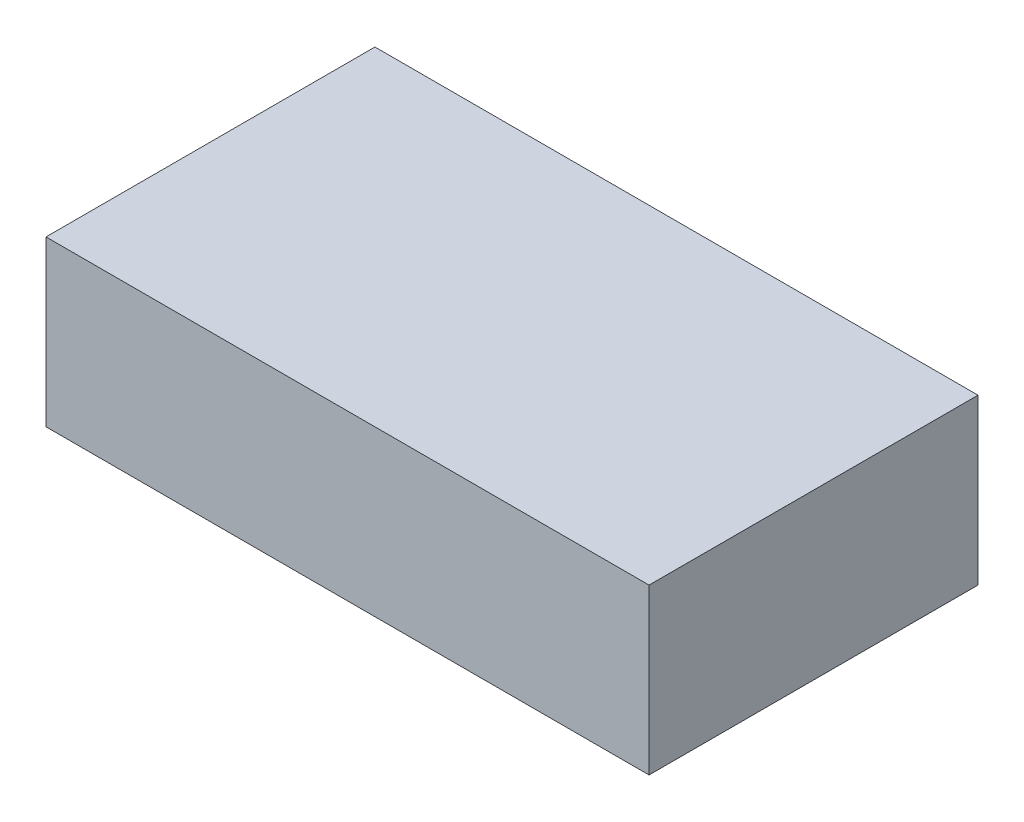
ISO-10303-21;
HEADER;
FILE_DESCRIPTION(('STEP AP214'),'2;1');
FILE_NAME('part.step','',(''),(''),'','','');
FILE_SCHEMA(('AUTOMOTIVE_DESIGN { 1 0 10303 214 1 1 1 1 }'));
ENDSEC;
DATA;
#1=APPLICATION_CONTEXT('core data for automotive mechanical design processes');
#2=APPLICATION_PROTOCOL_DEFINITION('international standard','automotive_design',2000,#1);
#3=PRODUCT_CONTEXT('',#1,'mechanical');
#4=PRODUCT('Part','Part','',(#3));
#5=PRODUCT_RELATED_PRODUCT_CATEGORY('part','',(#4));
#6=PRODUCT_DEFINITION_FORMATION('','',#4);
#7=PRODUCT_DEFINITION_CONTEXT('part definition',#1,'design');
#8=PRODUCT_DEFINITION('design','',#6,#7);
#9=PRODUCT_DEFINITION_SHAPE('','',#8);
#10=(LENGTH_UNIT() NAMED_UNIT(*) SI_UNIT(.MILLI.,.METRE.));
#11=(NAMED_UNIT(*) PLANE_ANGLE_UNIT() SI_UNIT($,.RADIAN.));
#12=(NAMED_UNIT(*) SI_UNIT($,.STERADIAN.) SOLID_ANGLE_UNIT());
#13=UNCERTAINTY_MEASURE_WITH_UNIT(LENGTH_MEASURE(1.E-05),#10,'distance_accuracy_value','');
#14=(GEOMETRIC_REPRESENTATION_CONTEXT(3) GLOBAL_UNCERTAINTY_ASSIGNED_CONTEXT((#13)) GLOBAL_UNIT_ASSIGNED_CONTEXT((#10,
#11,#12)) REPRESENTATION_CONTEXT('',''));
#15=CARTESIAN_POINT('',(0.,0.,0.));
#16=DIRECTION('',(0.,0.,1.));
#17=DIRECTION('',(1.,0.,0.));
#18=AXIS2_PLACEMENT_3D('',#15,#16,#17);
#19=CARTESIAN_POINT('',(0.,6.,0.));
#20=DIRECTION('',(1.,0.,0.));
#21=DIRECTION('',(0.,0.,-1.));
#22=AXIS2_PLACEMENT_3D('',#19,#20,#21);
#23=PLANE('',#22);
#24=DIRECTION('',(0.,0.,1.));
#25=VECTOR('',#24,1.);
#26=CARTESIAN_POINT('',(0.,0.,0.));
#27=LINE('',#26,#25);
#28=CARTESIAN_POINT('',(0.,0.,-12.));
#29=VERTEX_POINT('',#28);
#30=CARTESIAN_POINT('',(0.,0.,0.));
#31=VERTEX_POINT('',#30);
#32=EDGE_CURVE('E96',#29,#31,#27,.T.);
#33=ORIENTED_EDGE('',*,*,#32,.T.);
#34=DIRECTION('',(0.,-1.,0.));
#35=VECTOR('',#34,1.);
#36=CARTESIAN_POINT('',(0.,6.,0.));
#37=LINE('',#36,#35);
#38=CARTESIAN_POINT('',(0.,6.,0.));
#39=VERTEX_POINT('',#38);
#40=EDGE_CURVE('E11',#39,#31,#37,.T.);
#41=ORIENTED_EDGE('',*,*,#40,.F.);
#42=DIRECTION('',(0.,0.,1.));
#43=VECTOR('',#42,1.);
#44=CARTESIAN_POINT('',(0.,6.,0.));
#45=LINE('',#44,#43);
#46=CARTESIAN_POINT('',(0.,6.,-12.));
#47=VERTEX_POINT('',#46);
#48=EDGE_CURVE('E84',#47,#39,#45,.T.);
#49=ORIENTED_EDGE('',*,*,#48,.F.);
#50=DIRECTION('',(0.,-1.,0.));
#51=VECTOR('',#50,1.);
#52=CARTESIAN_POINT('',(0.,6.,-12.));
#53=LINE('',#52,#51);
#54=EDGE_CURVE('E92',#47,#29,#53,.T.);
#55=ORIENTED_EDGE('',*,*,#54,.T.);
#56=EDGE_LOOP('',(#33,#41,#49,#55));
#57=FACE_BOUND('',#56,.T.);
#58=ADVANCED_FACE('F33',(#57),#23,.F.);
#59=CARTESIAN_POINT('',(0.,6.,0.));
#60=DIRECTION('',(0.,0.,-1.));
#61=DIRECTION('',(-1.,0.,0.));
#62=AXIS2_PLACEMENT_3D('',#59,#60,#61);
#63=PLANE('',#62);
#64=DIRECTION('',(1.,0.,0.));
#65=VECTOR('',#64,1.);
#66=CARTESIAN_POINT('',(0.,0.,0.));
#67=LINE('',#66,#65);
#68=CARTESIAN_POINT('',(22.,0.,0.));
#69=VERTEX_POINT('',#68);
#70=EDGE_CURVE('E88',#31,#69,#67,.T.);
#71=ORIENTED_EDGE('',*,*,#70,.T.);
#72=DIRECTION('',(0.,-1.,0.));
#73=VECTOR('',#72,1.);
#74=CARTESIAN_POINT('',(22.,6.,0.));
#75=LINE('',#74,#73);
#76=CARTESIAN_POINT('',(22.,6.,0.));
#77=VERTEX_POINT('',#76);
#78=EDGE_CURVE('E41',#77,#69,#75,.T.);
#79=ORIENTED_EDGE('',*,*,#78,.F.);
#80=DIRECTION('',(1.,0.,0.));
#81=VECTOR('',#80,1.);
#82=CARTESIAN_POINT('',(0.,6.,0.));
#83=LINE('',#82,#81);
#84=EDGE_CURVE('E79',#39,#77,#83,.T.);
#85=ORIENTED_EDGE('',*,*,#84,.F.);
#86=ORIENTED_EDGE('',*,*,#40,.T.);
#87=EDGE_LOOP('',(#71,#79,#85,#86));
#88=FACE_BOUND('',#87,.T.);
#89=ADVANCED_FACE('F87',(#88),#63,.F.);
#90=CARTESIAN_POINT('',(22.,6.,0.));
#91=DIRECTION('',(-1.,0.,0.));
#92=DIRECTION('',(0.,0.,1.));
#93=AXIS2_PLACEMENT_3D('',#90,#91,#92);
#94=PLANE('',#93);
#95=DIRECTION('',(0.,0.,-1.));
#96=VECTOR('',#95,1.);
#97=CARTESIAN_POINT('',(22.,0.,0.));
#98=LINE('',#97,#96);
#99=CARTESIAN_POINT('',(22.,0.,-12.));
#100=VERTEX_POINT('',#99);
#101=EDGE_CURVE('E66',#69,#100,#98,.T.);
#102=ORIENTED_EDGE('',*,*,#101,.T.);
#103=DIRECTION('',(0.,-1.,0.));
#104=VECTOR('',#103,1.);
#105=CARTESIAN_POINT('',(22.,6.,-12.));
#106=LINE('',#105,#104);
#107=CARTESIAN_POINT('',(22.,6.,-12.));
#108=VERTEX_POINT('',#107);
#109=EDGE_CURVE('E89',#108,#100,#106,.T.);
#110=ORIENTED_EDGE('',*,*,#109,.F.);
#111=DIRECTION('',(0.,0.,-1.));
#112=VECTOR('',#111,1.);
#113=CARTESIAN_POINT('',(22.,6.,0.));
#114=LINE('',#113,#112);
#115=EDGE_CURVE('E82',#77,#108,#114,.T.);
#116=ORIENTED_EDGE('',*,*,#115,.F.);
#117=ORIENTED_EDGE('',*,*,#78,.T.);
#118=EDGE_LOOP('',(#102,#110,#116,#117));
#119=FACE_BOUND('',#118,.T.);
#120=ADVANCED_FACE('F90',(#119),#94,.F.);
#121=CARTESIAN_POINT('',(0.,6.,-12.));
#122=DIRECTION('',(0.,0.,1.));
#123=DIRECTION('',(1.,0.,0.));
#124=AXIS2_PLACEMENT_3D('',#121,#122,#123);
#125=PLANE('',#124);
#126=DIRECTION('',(-1.,0.,0.));
#127=VECTOR('',#126,1.);
#128=CARTESIAN_POINT('',(0.,0.,-12.));
#129=LINE('',#128,#127);
#130=EDGE_CURVE('E72',#100,#29,#129,.T.);
#131=ORIENTED_EDGE('',*,*,#130,.T.);
#132=ORIENTED_EDGE('',*,*,#54,.F.);
#133=DIRECTION('',(-1.,0.,0.));
#134=VECTOR('',#133,1.);
#135=CARTESIAN_POINT('',(0.,6.,-12.));
#136=LINE('',#135,#134);
#137=EDGE_CURVE('E49',#108,#47,#136,.T.);
#138=ORIENTED_EDGE('',*,*,#137,.F.);
#139=ORIENTED_EDGE('',*,*,#109,.T.);
#140=EDGE_LOOP('',(#131,#132,#138,#139));
#141=FACE_BOUND('',#140,.T.);
#142=ADVANCED_FACE('F103',(#141),#125,.F.);
#143=CARTESIAN_POINT('',(0.,6.,0.));
#144=DIRECTION('',(0.,-1.,0.));
#145=DIRECTION('',(0.,0.,-1.));
#146=AXIS2_PLACEMENT_3D('',#143,#144,#145);
#147=PLANE('',#146);
#148=ORIENTED_EDGE('',*,*,#48,.T.);
#149=ORIENTED_EDGE('',*,*,#84,.T.);
#150=ORIENTED_EDGE('',*,*,#115,.T.);
#151=ORIENTED_EDGE('',*,*,#137,.T.);
#152=EDGE_LOOP('',(#148,#149,#150,#151));
#153=FACE_BOUND('',#152,.T.);
#154=ADVANCED_FACE('F80',(#153),#147,.F.);
#155=CARTESIAN_POINT('',(0.,0.,0.));
#156=DIRECTION('',(0.,-1.,0.));
#157=DIRECTION('',(0.,0.,-1.));
#158=AXIS2_PLACEMENT_3D('',#155,#156,#157);
#159=PLANE('',#158);
#160=ORIENTED_EDGE('',*,*,#32,.F.);
#161=ORIENTED_EDGE('',*,*,#130,.F.);
#162=ORIENTED_EDGE('',*,*,#101,.F.);
#163=ORIENTED_EDGE('',*,*,#70,.F.);
#164=EDGE_LOOP('',(#160,#161,#162,#163));
#165=FACE_BOUND('',#164,.T.);
#166=ADVANCED_FACE('F106',(#165),#159,.T.);
#167=CLOSED_SHELL('',(#58,#89,#120,#142,#154,#166));
#168=MANIFOLD_SOLID_BREP('B2',#167);
#169=ADVANCED_BREP_SHAPE_REPRESENTATION('',(#18,#168),#14);
#170=SHAPE_DEFINITION_REPRESENTATION(#9,#169);
ENDSEC;
END-ISO-10303-21;
